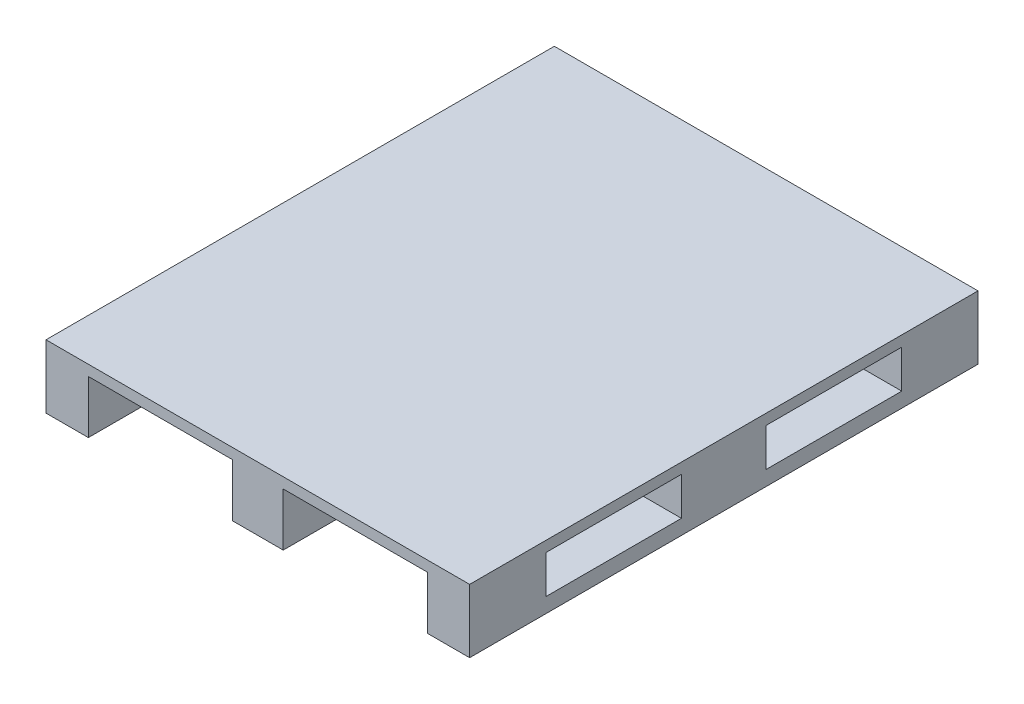
ISO-10303-21;
HEADER;
FILE_DESCRIPTION(('STEP AP214'),'2;1');
FILE_NAME('part.step','',(''),(''),'','','');
FILE_SCHEMA(('AUTOMOTIVE_DESIGN { 1 0 10303 214 1 1 1 1 }'));
ENDSEC;
DATA;
#1=APPLICATION_CONTEXT('core data for automotive mechanical design processes');
#2=APPLICATION_PROTOCOL_DEFINITION('international standard','automotive_design',2000,#1);
#3=PRODUCT_CONTEXT('',#1,'mechanical');
#4=PRODUCT('Part','Part','',(#3));
#5=PRODUCT_RELATED_PRODUCT_CATEGORY('part','',(#4));
#6=PRODUCT_DEFINITION_FORMATION('','',#4);
#7=PRODUCT_DEFINITION_CONTEXT('part definition',#1,'design');
#8=PRODUCT_DEFINITION('design','',#6,#7);
#9=PRODUCT_DEFINITION_SHAPE('','',#8);
#10=(LENGTH_UNIT() NAMED_UNIT(*) SI_UNIT(.MILLI.,.METRE.));
#11=(NAMED_UNIT(*) PLANE_ANGLE_UNIT() SI_UNIT($,.RADIAN.));
#12=(NAMED_UNIT(*) SI_UNIT($,.STERADIAN.) SOLID_ANGLE_UNIT());
#13=UNCERTAINTY_MEASURE_WITH_UNIT(LENGTH_MEASURE(1.E-05),#10,'distance_accuracy_value','');
#14=(GEOMETRIC_REPRESENTATION_CONTEXT(3) GLOBAL_UNCERTAINTY_ASSIGNED_CONTEXT((#13)) GLOBAL_UNIT_ASSIGNED_CONTEXT((#10,
#11,#12)) REPRESENTATION_CONTEXT('',''));
#15=CARTESIAN_POINT('',(0.,0.,0.));
#16=DIRECTION('',(0.,0.,1.));
#17=DIRECTION('',(1.,0.,0.));
#18=AXIS2_PLACEMENT_3D('',#15,#16,#17);
#19=CARTESIAN_POINT('',(0.,-75.,0.));
#20=DIRECTION('',(0.,1.,0.));
#21=DIRECTION('',(0.,0.,1.));
#22=AXIS2_PLACEMENT_3D('',#19,#20,#21);
#23=PLANE('',#22);
#24=DIRECTION('',(-1.,0.,0.));
#25=VECTOR('',#24,1.);
#26=CARTESIAN_POINT('',(500.,-75.,-600.));
#27=LINE('',#26,#25);
#28=CARTESIAN_POINT('',(-400.,-75.,-600.));
#29=VERTEX_POINT('',#28);
#30=CARTESIAN_POINT('',(-500.,-75.,-600.));
#31=VERTEX_POINT('',#30);
#32=EDGE_CURVE('E570',#29,#31,#27,.T.);
#33=ORIENTED_EDGE('',*,*,#32,.F.);
#34=DIRECTION('',(0.,0.,1.));
#35=VECTOR('',#34,1.);
#36=CARTESIAN_POINT('',(-400.,-75.,-600.001));
#37=LINE('',#36,#35);
#38=CARTESIAN_POINT('',(-400.,-75.,600.));
#39=VERTEX_POINT('',#38);
#40=EDGE_CURVE('E485',#29,#39,#37,.T.);
#41=ORIENTED_EDGE('',*,*,#40,.T.);
#42=DIRECTION('',(1.,0.,0.));
#43=VECTOR('',#42,1.);
#44=CARTESIAN_POINT('',(500.,-75.,600.));
#45=LINE('',#44,#43);
#46=CARTESIAN_POINT('',(-500.,-75.,600.));
#47=VERTEX_POINT('',#46);
#48=EDGE_CURVE('E563',#47,#39,#45,.T.);
#49=ORIENTED_EDGE('',*,*,#48,.F.);
#50=DIRECTION('',(0.,0.,1.));
#51=VECTOR('',#50,1.);
#52=CARTESIAN_POINT('',(-500.,-75.,600.));
#53=LINE('',#52,#51);
#54=EDGE_CURVE('E490',#31,#47,#53,.T.);
#55=ORIENTED_EDGE('',*,*,#54,.F.);
#56=EDGE_LOOP('',(#33,#41,#49,#55));
#57=FACE_BOUND('',#56,.T.);
#58=ADVANCED_FACE('F38',(#57),#23,.F.);
#59=CARTESIAN_POINT('',(-59.9999999999999,-75.,600.));
#60=VERTEX_POINT('',#59);
#61=CARTESIAN_POINT('',(60.0000000000001,-75.,600.));
#62=VERTEX_POINT('',#61);
#63=EDGE_CURVE('E568',#60,#62,#45,.T.);
#64=ORIENTED_EDGE('',*,*,#63,.F.);
#65=DIRECTION('',(0.,0.,1.));
#66=VECTOR('',#65,1.);
#67=CARTESIAN_POINT('',(-59.9999999999999,-75.,-600.001));
#68=LINE('',#67,#66);
#69=CARTESIAN_POINT('',(-59.9999999999999,-75.,-600.));
#70=VERTEX_POINT('',#69);
#71=EDGE_CURVE('E499',#70,#60,#68,.T.);
#72=ORIENTED_EDGE('',*,*,#71,.F.);
#73=CARTESIAN_POINT('',(60.0000000000001,-75.,-600.));
#74=VERTEX_POINT('',#73);
#75=EDGE_CURVE('E574',#74,#70,#27,.T.);
#76=ORIENTED_EDGE('',*,*,#75,.F.);
#77=DIRECTION('',(0.,0.,1.));
#78=VECTOR('',#77,1.);
#79=CARTESIAN_POINT('',(60.0000000000001,-75.,-600.001));
#80=LINE('',#79,#78);
#81=EDGE_CURVE('E526',#74,#62,#80,.T.);
#82=ORIENTED_EDGE('',*,*,#81,.T.);
#83=EDGE_LOOP('',(#64,#72,#76,#82));
#84=FACE_BOUND('',#83,.T.);
#85=ADVANCED_FACE('F664',(#84),#23,.F.);
#86=CARTESIAN_POINT('',(-500.,75.,600.));
#87=DIRECTION('',(1.,0.,0.));
#88=DIRECTION('',(0.,0.,-1.));
#89=AXIS2_PLACEMENT_3D('',#86,#87,#88);
#90=PLANE('',#89);
#91=DIRECTION('',(0.,0.,1.));
#92=VECTOR('',#91,1.);
#93=CARTESIAN_POINT('',(-500.,-40.,-100.));
#94=LINE('',#93,#92);
#95=CARTESIAN_POINT('',(-500.,-40.,-420.));
#96=VERTEX_POINT('',#95);
#97=CARTESIAN_POINT('',(-500.,-40.,-100.));
#98=VERTEX_POINT('',#97);
#99=EDGE_CURVE('E320',#96,#98,#94,.T.);
#100=ORIENTED_EDGE('',*,*,#99,.F.);
#101=DIRECTION('',(0.,-1.,0.));
#102=VECTOR('',#101,1.);
#103=CARTESIAN_POINT('',(-500.,-40.,-420.));
#104=LINE('',#103,#102);
#105=CARTESIAN_POINT('',(-500.,50.,-420.));
#106=VERTEX_POINT('',#105);
#107=EDGE_CURVE('E54',#106,#96,#104,.T.);
#108=ORIENTED_EDGE('',*,*,#107,.F.);
#109=DIRECTION('',(0.,0.,-1.));
#110=VECTOR('',#109,1.);
#111=CARTESIAN_POINT('',(-500.,50.,-100.));
#112=LINE('',#111,#110);
#113=CARTESIAN_POINT('',(-500.,50.,-100.));
#114=VERTEX_POINT('',#113);
#115=EDGE_CURVE('E305',#114,#106,#112,.T.);
#116=ORIENTED_EDGE('',*,*,#115,.F.);
#117=DIRECTION('',(0.,1.,0.));
#118=VECTOR('',#117,1.);
#119=CARTESIAN_POINT('',(-500.,-40.,-100.));
#120=LINE('',#119,#118);
#121=EDGE_CURVE('E311',#98,#114,#120,.T.);
#122=ORIENTED_EDGE('',*,*,#121,.F.);
#123=EDGE_LOOP('',(#100,#108,#116,#122));
#124=FACE_BOUND('',#123,.T.);
#125=DIRECTION('',(0.,0.,1.));
#126=VECTOR('',#125,1.);
#127=CARTESIAN_POINT('',(-500.,-40.,100.));
#128=LINE('',#127,#126);
#129=CARTESIAN_POINT('',(-500.,-40.,100.));
#130=VERTEX_POINT('',#129);
#131=CARTESIAN_POINT('',(-500.,-39.9999999999999,420.));
#132=VERTEX_POINT('',#131);
#133=EDGE_CURVE('E363',#130,#132,#128,.T.);
#134=ORIENTED_EDGE('',*,*,#133,.F.);
#135=DIRECTION('',(0.,-1.,0.));
#136=VECTOR('',#135,1.);
#137=CARTESIAN_POINT('',(-500.,-40.,100.));
#138=LINE('',#137,#136);
#139=CARTESIAN_POINT('',(-500.,50.,100.));
#140=VERTEX_POINT('',#139);
#141=EDGE_CURVE('E62',#140,#130,#138,.T.);
#142=ORIENTED_EDGE('',*,*,#141,.F.);
#143=DIRECTION('',(0.,0.,-1.));
#144=VECTOR('',#143,1.);
#145=CARTESIAN_POINT('',(-500.,50.,100.));
#146=LINE('',#145,#144);
#147=CARTESIAN_POINT('',(-500.,50.0000000000001,420.));
#148=VERTEX_POINT('',#147);
#149=EDGE_CURVE('E348',#148,#140,#146,.T.);
#150=ORIENTED_EDGE('',*,*,#149,.F.);
#151=DIRECTION('',(0.,1.,0.));
#152=VECTOR('',#151,1.);
#153=CARTESIAN_POINT('',(-500.,-39.9999999999999,420.));
#154=LINE('',#153,#152);
#155=EDGE_CURVE('E367',#132,#148,#154,.T.);
#156=ORIENTED_EDGE('',*,*,#155,.F.);
#157=EDGE_LOOP('',(#134,#142,#150,#156));
#158=FACE_BOUND('',#157,.T.);
#159=ORIENTED_EDGE('',*,*,#54,.T.);
#160=DIRECTION('',(0.,-1.,0.));
#161=VECTOR('',#160,1.);
#162=CARTESIAN_POINT('',(-500.,75.,600.));
#163=LINE('',#162,#161);
#164=CARTESIAN_POINT('',(-500.,75.,600.));
#165=VERTEX_POINT('',#164);
#166=EDGE_CURVE('E586',#165,#47,#163,.T.);
#167=ORIENTED_EDGE('',*,*,#166,.F.);
#168=DIRECTION('',(0.,0.,1.));
#169=VECTOR('',#168,1.);
#170=CARTESIAN_POINT('',(-500.,75.,600.));
#171=LINE('',#170,#169);
#172=CARTESIAN_POINT('',(-500.,75.,-600.));
#173=VERTEX_POINT('',#172);
#174=EDGE_CURVE('E544',#173,#165,#171,.T.);
#175=ORIENTED_EDGE('',*,*,#174,.F.);
#176=DIRECTION('',(0.,-1.,0.));
#177=VECTOR('',#176,1.);
#178=CARTESIAN_POINT('',(-500.,75.,-600.));
#179=LINE('',#178,#177);
#180=EDGE_CURVE('E558',#173,#31,#179,.T.);
#181=ORIENTED_EDGE('',*,*,#180,.T.);
#182=EDGE_LOOP('',(#159,#167,#175,#181));
#183=FACE_BOUND('',#182,.T.);
#184=ADVANCED_FACE('F40',(#124,#158,#183),#90,.F.);
#185=CARTESIAN_POINT('',(500.,75.,600.));
#186=DIRECTION('',(0.,0.,-1.));
#187=DIRECTION('',(-1.,0.,0.));
#188=AXIS2_PLACEMENT_3D('',#185,#186,#187);
#189=PLANE('',#188);
#190=ORIENTED_EDGE('',*,*,#48,.T.);
#191=DIRECTION('',(0.,-1.,0.));
#192=VECTOR('',#191,1.);
#193=CARTESIAN_POINT('',(-400.,50.,600.));
#194=LINE('',#193,#192);
#195=CARTESIAN_POINT('',(-400.,50.,600.));
#196=VERTEX_POINT('',#195);
#197=EDGE_CURVE('E474',#196,#39,#194,.T.);
#198=ORIENTED_EDGE('',*,*,#197,.F.);
#199=DIRECTION('',(-1.,0.,0.));
#200=VECTOR('',#199,1.);
#201=CARTESIAN_POINT('',(-59.9999999999999,50.,600.));
#202=LINE('',#201,#200);
#203=CARTESIAN_POINT('',(-59.9999999999999,50.,600.));
#204=VERTEX_POINT('',#203);
#205=EDGE_CURVE('E481',#204,#196,#202,.T.);
#206=ORIENTED_EDGE('',*,*,#205,.F.);
#207=DIRECTION('',(0.,1.,0.));
#208=VECTOR('',#207,1.);
#209=CARTESIAN_POINT('',(-59.9999999999999,50.,600.));
#210=LINE('',#209,#208);
#211=EDGE_CURVE('E477',#60,#204,#210,.T.);
#212=ORIENTED_EDGE('',*,*,#211,.F.);
#213=ORIENTED_EDGE('',*,*,#63,.T.);
#214=DIRECTION('',(0.,-1.,0.));
#215=VECTOR('',#214,1.);
#216=CARTESIAN_POINT('',(60.0000000000001,50.,600.));
#217=LINE('',#216,#215);
#218=CARTESIAN_POINT('',(60.0000000000001,50.,600.));
#219=VERTEX_POINT('',#218);
#220=EDGE_CURVE('E515',#219,#62,#217,.T.);
#221=ORIENTED_EDGE('',*,*,#220,.F.);
#222=DIRECTION('',(-1.,0.,0.));
#223=VECTOR('',#222,1.);
#224=CARTESIAN_POINT('',(60.0000000000001,50.,600.));
#225=LINE('',#224,#223);
#226=CARTESIAN_POINT('',(400.,50.,600.));
#227=VERTEX_POINT('',#226);
#228=EDGE_CURVE('E522',#227,#219,#225,.T.);
#229=ORIENTED_EDGE('',*,*,#228,.F.);
#230=DIRECTION('',(0.,1.,0.));
#231=VECTOR('',#230,1.);
#232=CARTESIAN_POINT('',(400.,50.,600.));
#233=LINE('',#232,#231);
#234=CARTESIAN_POINT('',(400.,-74.9999999999999,600.));
#235=VERTEX_POINT('',#234);
#236=EDGE_CURVE('E518',#235,#227,#233,.T.);
#237=ORIENTED_EDGE('',*,*,#236,.F.);
#238=CARTESIAN_POINT('',(500.,-75.,600.));
#239=VERTEX_POINT('',#238);
#240=EDGE_CURVE('E562',#235,#239,#45,.T.);
#241=ORIENTED_EDGE('',*,*,#240,.T.);
#242=DIRECTION('',(0.,-1.,0.));
#243=VECTOR('',#242,1.);
#244=CARTESIAN_POINT('',(500.,75.,600.));
#245=LINE('',#244,#243);
#246=CARTESIAN_POINT('',(500.,75.,600.));
#247=VERTEX_POINT('',#246);
#248=EDGE_CURVE('E582',#247,#239,#245,.T.);
#249=ORIENTED_EDGE('',*,*,#248,.F.);
#250=DIRECTION('',(1.,0.,0.));
#251=VECTOR('',#250,1.);
#252=CARTESIAN_POINT('',(500.,75.,600.));
#253=LINE('',#252,#251);
#254=EDGE_CURVE('E548',#165,#247,#253,.T.);
#255=ORIENTED_EDGE('',*,*,#254,.F.);
#256=ORIENTED_EDGE('',*,*,#166,.T.);
#257=EDGE_LOOP('',(#190,#198,#206,#212,#213,#221,#229,#237,#241,#249,#255,#256));
#258=FACE_BOUND('',#257,.T.);
#259=ADVANCED_FACE('F672',(#258),#189,.F.);
#260=CARTESIAN_POINT('',(500.,75.,600.));
#261=DIRECTION('',(-1.,0.,0.));
#262=DIRECTION('',(0.,0.,1.));
#263=AXIS2_PLACEMENT_3D('',#260,#261,#262);
#264=PLANE('',#263);
#265=DIRECTION('',(0.,0.,-1.));
#266=VECTOR('',#265,1.);
#267=CARTESIAN_POINT('',(500.,50.,-100.));
#268=LINE('',#267,#266);
#269=CARTESIAN_POINT('',(500.,50.,-100.));
#270=VERTEX_POINT('',#269);
#271=CARTESIAN_POINT('',(500.,50.,-420.));
#272=VERTEX_POINT('',#271);
#273=EDGE_CURVE('E303',#270,#272,#268,.T.);
#274=ORIENTED_EDGE('',*,*,#273,.T.);
#275=DIRECTION('',(0.,-1.,0.));
#276=VECTOR('',#275,1.);
#277=CARTESIAN_POINT('',(500.,-40.,-420.));
#278=LINE('',#277,#276);
#279=CARTESIAN_POINT('',(500.,-40.,-420.));
#280=VERTEX_POINT('',#279);
#281=EDGE_CURVE('E278',#272,#280,#278,.T.);
#282=ORIENTED_EDGE('',*,*,#281,.T.);
#283=DIRECTION('',(0.,0.,1.));
#284=VECTOR('',#283,1.);
#285=CARTESIAN_POINT('',(500.,-40.,-100.));
#286=LINE('',#285,#284);
#287=CARTESIAN_POINT('',(500.,-40.,-100.));
#288=VERTEX_POINT('',#287);
#289=EDGE_CURVE('E291',#280,#288,#286,.T.);
#290=ORIENTED_EDGE('',*,*,#289,.T.);
#291=DIRECTION('',(0.,1.,0.));
#292=VECTOR('',#291,1.);
#293=CARTESIAN_POINT('',(500.,-40.,-100.));
#294=LINE('',#293,#292);
#295=EDGE_CURVE('E298',#288,#270,#294,.T.);
#296=ORIENTED_EDGE('',*,*,#295,.T.);
#297=EDGE_LOOP('',(#274,#282,#290,#296));
#298=FACE_BOUND('',#297,.T.);
#299=DIRECTION('',(0.,0.,-1.));
#300=VECTOR('',#299,1.);
#301=CARTESIAN_POINT('',(500.,50.,100.));
#302=LINE('',#301,#300);
#303=CARTESIAN_POINT('',(500.,50.0000000000001,420.));
#304=VERTEX_POINT('',#303);
#305=CARTESIAN_POINT('',(500.,50.,100.));
#306=VERTEX_POINT('',#305);
#307=EDGE_CURVE('E356',#304,#306,#302,.T.);
#308=ORIENTED_EDGE('',*,*,#307,.T.);
#309=DIRECTION('',(0.,-1.,0.));
#310=VECTOR('',#309,1.);
#311=CARTESIAN_POINT('',(500.,-40.,100.));
#312=LINE('',#311,#310);
#313=CARTESIAN_POINT('',(500.,-40.,100.));
#314=VERTEX_POINT('',#313);
#315=EDGE_CURVE('E343',#306,#314,#312,.T.);
#316=ORIENTED_EDGE('',*,*,#315,.T.);
#317=DIRECTION('',(0.,0.,1.));
#318=VECTOR('',#317,1.);
#319=CARTESIAN_POINT('',(500.,-40.,100.));
#320=LINE('',#319,#318);
#321=CARTESIAN_POINT('',(500.,-39.9999999999999,420.));
#322=VERTEX_POINT('',#321);
#323=EDGE_CURVE('E347',#314,#322,#320,.T.);
#324=ORIENTED_EDGE('',*,*,#323,.T.);
#325=DIRECTION('',(0.,1.,0.));
#326=VECTOR('',#325,1.);
#327=CARTESIAN_POINT('',(500.,-39.9999999999999,420.));
#328=LINE('',#327,#326);
#329=EDGE_CURVE('E352',#322,#304,#328,.T.);
#330=ORIENTED_EDGE('',*,*,#329,.T.);
#331=EDGE_LOOP('',(#308,#316,#324,#330));
#332=FACE_BOUND('',#331,.T.);
#333=DIRECTION('',(0.,0.,-1.));
#334=VECTOR('',#333,1.);
#335=CARTESIAN_POINT('',(500.,-75.,600.));
#336=LINE('',#335,#334);
#337=CARTESIAN_POINT('',(500.,-75.,-600.));
#338=VERTEX_POINT('',#337);
#339=EDGE_CURVE('E567',#239,#338,#336,.T.);
#340=ORIENTED_EDGE('',*,*,#339,.T.);
#341=DIRECTION('',(0.,-1.,0.));
#342=VECTOR('',#341,1.);
#343=CARTESIAN_POINT('',(500.,75.,-600.));
#344=LINE('',#343,#342);
#345=CARTESIAN_POINT('',(500.,75.,-600.));
#346=VERTEX_POINT('',#345);
#347=EDGE_CURVE('E578',#346,#338,#344,.T.);
#348=ORIENTED_EDGE('',*,*,#347,.F.);
#349=DIRECTION('',(0.,0.,-1.));
#350=VECTOR('',#349,1.);
#351=CARTESIAN_POINT('',(500.,75.,600.));
#352=LINE('',#351,#350);
#353=EDGE_CURVE('E552',#247,#346,#352,.T.);
#354=ORIENTED_EDGE('',*,*,#353,.F.);
#355=ORIENTED_EDGE('',*,*,#248,.T.);
#356=EDGE_LOOP('',(#340,#348,#354,#355));
#357=FACE_BOUND('',#356,.T.);
#358=ADVANCED_FACE('F300',(#298,#332,#357),#264,.F.);
#359=CARTESIAN_POINT('',(500.,75.,-600.));
#360=DIRECTION('',(0.,0.,1.));
#361=DIRECTION('',(1.,0.,0.));
#362=AXIS2_PLACEMENT_3D('',#359,#360,#361);
#363=PLANE('',#362);
#364=DIRECTION('',(1.,0.,0.));
#365=VECTOR('',#364,1.);
#366=CARTESIAN_POINT('',(-59.9999999999999,50.,-600.));
#367=LINE('',#366,#365);
#368=CARTESIAN_POINT('',(-400.,50.,-600.));
#369=VERTEX_POINT('',#368);
#370=CARTESIAN_POINT('',(-59.9999999999999,50.,-600.));
#371=VERTEX_POINT('',#370);
#372=EDGE_CURVE('E465',#369,#371,#367,.T.);
#373=ORIENTED_EDGE('',*,*,#372,.F.);
#374=DIRECTION('',(0.,1.,0.));
#375=VECTOR('',#374,1.);
#376=CARTESIAN_POINT('',(-400.,50.,-600.));
#377=LINE('',#376,#375);
#378=EDGE_CURVE('E470',#29,#369,#377,.T.);
#379=ORIENTED_EDGE('',*,*,#378,.F.);
#380=ORIENTED_EDGE('',*,*,#32,.T.);
#381=ORIENTED_EDGE('',*,*,#180,.F.);
#382=DIRECTION('',(-1.,0.,0.));
#383=VECTOR('',#382,1.);
#384=CARTESIAN_POINT('',(500.,75.,-600.));
#385=LINE('',#384,#383);
#386=EDGE_CURVE('E555',#346,#173,#385,.T.);
#387=ORIENTED_EDGE('',*,*,#386,.F.);
#388=ORIENTED_EDGE('',*,*,#347,.T.);
#389=CARTESIAN_POINT('',(400.,-75.,-600.));
#390=VERTEX_POINT('',#389);
#391=EDGE_CURVE('E549',#338,#390,#27,.T.);
#392=ORIENTED_EDGE('',*,*,#391,.T.);
#393=DIRECTION('',(0.,-1.,0.));
#394=VECTOR('',#393,1.);
#395=CARTESIAN_POINT('',(400.,50.,-600.));
#396=LINE('',#395,#394);
#397=CARTESIAN_POINT('',(400.,50.,-600.));
#398=VERTEX_POINT('',#397);
#399=EDGE_CURVE('E461',#398,#390,#396,.T.);
#400=ORIENTED_EDGE('',*,*,#399,.F.);
#401=DIRECTION('',(1.,0.,0.));
#402=VECTOR('',#401,1.);
#403=CARTESIAN_POINT('',(60.0000000000001,50.,-600.));
#404=LINE('',#403,#402);
#405=CARTESIAN_POINT('',(60.0000000000001,50.,-600.));
#406=VERTEX_POINT('',#405);
#407=EDGE_CURVE('E507',#406,#398,#404,.T.);
#408=ORIENTED_EDGE('',*,*,#407,.F.);
#409=DIRECTION('',(0.,1.,0.));
#410=VECTOR('',#409,1.);
#411=CARTESIAN_POINT('',(60.0000000000001,50.,-600.));
#412=LINE('',#411,#410);
#413=EDGE_CURVE('E511',#74,#406,#412,.T.);
#414=ORIENTED_EDGE('',*,*,#413,.F.);
#415=ORIENTED_EDGE('',*,*,#75,.T.);
#416=DIRECTION('',(0.,-1.,0.));
#417=VECTOR('',#416,1.);
#418=CARTESIAN_POINT('',(-59.9999999999999,50.,-600.));
#419=LINE('',#418,#417);
#420=EDGE_CURVE('E462',#371,#70,#419,.T.);
#421=ORIENTED_EDGE('',*,*,#420,.F.);
#422=EDGE_LOOP('',(#373,#379,#380,#381,#387,#388,#392,#400,#408,#414,#415,#421));
#423=FACE_BOUND('',#422,.T.);
#424=ADVANCED_FACE('F657',(#423),#363,.F.);
#425=CARTESIAN_POINT('',(0.,75.,0.));
#426=DIRECTION('',(0.,1.,0.));
#427=DIRECTION('',(0.,0.,1.));
#428=AXIS2_PLACEMENT_3D('',#425,#426,#427);
#429=PLANE('',#428);
#430=ORIENTED_EDGE('',*,*,#174,.T.);
#431=ORIENTED_EDGE('',*,*,#254,.T.);
#432=ORIENTED_EDGE('',*,*,#353,.T.);
#433=ORIENTED_EDGE('',*,*,#386,.T.);
#434=EDGE_LOOP('',(#430,#431,#432,#433));
#435=FACE_BOUND('',#434,.T.);
#436=ADVANCED_FACE('F688',(#435),#429,.T.);
#437=ORIENTED_EDGE('',*,*,#240,.F.);
#438=DIRECTION('',(0.,0.,1.));
#439=VECTOR('',#438,1.);
#440=CARTESIAN_POINT('',(400.,-74.9999999999999,-600.001));
#441=LINE('',#440,#439);
#442=EDGE_CURVE('E538',#390,#235,#441,.T.);
#443=ORIENTED_EDGE('',*,*,#442,.F.);
#444=ORIENTED_EDGE('',*,*,#391,.F.);
#445=ORIENTED_EDGE('',*,*,#339,.F.);
#446=EDGE_LOOP('',(#437,#443,#444,#445));
#447=FACE_BOUND('',#446,.T.);
#448=ADVANCED_FACE('F681',(#447),#23,.F.);
#449=CARTESIAN_POINT('',(60.0000000000001,50.,-600.001));
#450=DIRECTION('',(-1.,0.,0.));
#451=DIRECTION('',(0.,-1.,0.));
#452=AXIS2_PLACEMENT_3D('',#449,#450,#451);
#453=PLANE('',#452);
#454=DIRECTION('',(0.,0.,1.));
#455=VECTOR('',#454,1.);
#456=CARTESIAN_POINT('',(60.0000000000001,50.,-600.001));
#457=LINE('',#456,#455);
#458=CARTESIAN_POINT('',(60.0000000000001,50.,-420.));
#459=VERTEX_POINT('',#458);
#460=EDGE_CURVE('E466',#406,#459,#457,.T.);
#461=ORIENTED_EDGE('',*,*,#460,.T.);
#462=DIRECTION('',(0.,-1.,0.));
#463=VECTOR('',#462,1.);
#464=CARTESIAN_POINT('',(60.0000000000001,50.,-420.));
#465=LINE('',#464,#463);
#466=CARTESIAN_POINT('',(60.0000000000001,-40.,-420.));
#467=VERTEX_POINT('',#466);
#468=EDGE_CURVE('E457',#459,#467,#465,.T.);
#469=ORIENTED_EDGE('',*,*,#468,.T.);
#470=DIRECTION('',(0.,0.,1.));
#471=VECTOR('',#470,1.);
#472=CARTESIAN_POINT('',(60.0000000000001,-40.0000000000001,-600.001));
#473=LINE('',#472,#471);
#474=CARTESIAN_POINT('',(60.0000000000001,-40.,-100.));
#475=VERTEX_POINT('',#474);
#476=EDGE_CURVE('E435',#467,#475,#473,.T.);
#477=ORIENTED_EDGE('',*,*,#476,.T.);
#478=DIRECTION('',(0.,1.,0.));
#479=VECTOR('',#478,1.);
#480=CARTESIAN_POINT('',(60.0000000000001,50.,-100.));
#481=LINE('',#480,#479);
#482=CARTESIAN_POINT('',(60.0000000000001,50.,-100.));
#483=VERTEX_POINT('',#482);
#484=EDGE_CURVE('E447',#475,#483,#481,.T.);
#485=ORIENTED_EDGE('',*,*,#484,.T.);
#486=CARTESIAN_POINT('',(60.0000000000001,50.,100.));
#487=VERTEX_POINT('',#486);
#488=EDGE_CURVE('E530',#483,#487,#457,.T.);
#489=ORIENTED_EDGE('',*,*,#488,.T.);
#490=DIRECTION('',(0.,-1.,0.));
#491=VECTOR('',#490,1.);
#492=CARTESIAN_POINT('',(60.0000000000001,50.,100.));
#493=LINE('',#492,#491);
#494=CARTESIAN_POINT('',(60.0000000000001,-40.,100.));
#495=VERTEX_POINT('',#494);
#496=EDGE_CURVE('E424',#487,#495,#493,.T.);
#497=ORIENTED_EDGE('',*,*,#496,.T.);
#498=DIRECTION('',(0.,0.,1.));
#499=VECTOR('',#498,1.);
#500=CARTESIAN_POINT('',(60.0000000000001,-40.,-600.001));
#501=LINE('',#500,#499);
#502=CARTESIAN_POINT('',(60.0000000000001,-39.9999999999999,420.));
#503=VERTEX_POINT('',#502);
#504=EDGE_CURVE('E400',#495,#503,#501,.T.);
#505=ORIENTED_EDGE('',*,*,#504,.T.);
#506=DIRECTION('',(0.,1.,0.));
#507=VECTOR('',#506,1.);
#508=CARTESIAN_POINT('',(60.0000000000001,50.,420.));
#509=LINE('',#508,#507);
#510=CARTESIAN_POINT('',(60.0000000000001,50.0000000000001,420.));
#511=VERTEX_POINT('',#510);
#512=EDGE_CURVE('E412',#503,#511,#509,.T.);
#513=ORIENTED_EDGE('',*,*,#512,.T.);
#514=EDGE_CURVE('E531',#511,#219,#457,.T.);
#515=ORIENTED_EDGE('',*,*,#514,.T.);
#516=ORIENTED_EDGE('',*,*,#220,.T.);
#517=ORIENTED_EDGE('',*,*,#81,.F.);
#518=ORIENTED_EDGE('',*,*,#413,.T.);
#519=EDGE_LOOP('',(#461,#469,#477,#485,#489,#497,#505,#513,#515,#516,#517,#518));
#520=FACE_BOUND('',#519,.T.);
#521=ADVANCED_FACE('F737',(#520),#453,.F.);
#522=CARTESIAN_POINT('',(400.,50.,-600.001));
#523=DIRECTION('',(1.,0.,0.));
#524=DIRECTION('',(0.,0.,-1.));
#525=AXIS2_PLACEMENT_3D('',#522,#523,#524);
#526=PLANE('',#525);
#527=DIRECTION('',(0.,0.,-1.));
#528=VECTOR('',#527,1.);
#529=CARTESIAN_POINT('',(400.,-40.0000000000001,-600.001));
#530=LINE('',#529,#528);
#531=CARTESIAN_POINT('',(400.,-40.,-100.));
#532=VERTEX_POINT('',#531);
#533=CARTESIAN_POINT('',(400.,-40.,-420.));
#534=VERTEX_POINT('',#533);
#535=EDGE_CURVE('E432',#532,#534,#530,.T.);
#536=ORIENTED_EDGE('',*,*,#535,.T.);
#537=DIRECTION('',(0.,1.,0.));
#538=VECTOR('',#537,1.);
#539=CARTESIAN_POINT('',(400.,50.,-420.));
#540=LINE('',#539,#538);
#541=CARTESIAN_POINT('',(400.,50.,-420.));
#542=VERTEX_POINT('',#541);
#543=EDGE_CURVE('E281',#534,#542,#540,.T.);
#544=ORIENTED_EDGE('',*,*,#543,.T.);
#545=DIRECTION('',(0.,0.,1.));
#546=VECTOR('',#545,1.);
#547=CARTESIAN_POINT('',(400.,50.,-600.001));
#548=LINE('',#547,#546);
#549=EDGE_CURVE('E532',#398,#542,#548,.T.);
#550=ORIENTED_EDGE('',*,*,#549,.F.);
#551=ORIENTED_EDGE('',*,*,#399,.T.);
#552=ORIENTED_EDGE('',*,*,#442,.T.);
#553=ORIENTED_EDGE('',*,*,#236,.T.);
#554=CARTESIAN_POINT('',(400.,50.0000000000001,420.));
#555=VERTEX_POINT('',#554);
#556=EDGE_CURVE('E537',#555,#227,#548,.T.);
#557=ORIENTED_EDGE('',*,*,#556,.F.);
#558=DIRECTION('',(0.,-1.,0.));
#559=VECTOR('',#558,1.);
#560=CARTESIAN_POINT('',(400.,50.,420.));
#561=LINE('',#560,#559);
#562=CARTESIAN_POINT('',(400.,-39.9999999999999,420.));
#563=VERTEX_POINT('',#562);
#564=EDGE_CURVE('E408',#555,#563,#561,.T.);
#565=ORIENTED_EDGE('',*,*,#564,.T.);
#566=DIRECTION('',(0.,0.,-1.));
#567=VECTOR('',#566,1.);
#568=CARTESIAN_POINT('',(400.,-40.,-600.001));
#569=LINE('',#568,#567);
#570=CARTESIAN_POINT('',(400.,-40.,100.));
#571=VERTEX_POINT('',#570);
#572=EDGE_CURVE('E396',#563,#571,#569,.T.);
#573=ORIENTED_EDGE('',*,*,#572,.T.);
#574=DIRECTION('',(0.,1.,0.));
#575=VECTOR('',#574,1.);
#576=CARTESIAN_POINT('',(400.,50.,100.));
#577=LINE('',#576,#575);
#578=CARTESIAN_POINT('',(400.,50.,100.));
#579=VERTEX_POINT('',#578);
#580=EDGE_CURVE('E420',#571,#579,#577,.T.);
#581=ORIENTED_EDGE('',*,*,#580,.T.);
#582=CARTESIAN_POINT('',(400.,50.,-100.));
#583=VERTEX_POINT('',#582);
#584=EDGE_CURVE('E536',#583,#579,#548,.T.);
#585=ORIENTED_EDGE('',*,*,#584,.F.);
#586=DIRECTION('',(0.,-1.,0.));
#587=VECTOR('',#586,1.);
#588=CARTESIAN_POINT('',(400.,50.,-100.));
#589=LINE('',#588,#587);
#590=EDGE_CURVE('E443',#583,#532,#589,.T.);
#591=ORIENTED_EDGE('',*,*,#590,.T.);
#592=EDGE_LOOP('',(#536,#544,#550,#551,#552,#553,#557,#565,#573,#581,#585,#591));
#593=FACE_BOUND('',#592,.T.);
#594=ADVANCED_FACE('F735',(#593),#526,.F.);
#595=CARTESIAN_POINT('',(-400.,50.,-600.001));
#596=DIRECTION('',(-1.,0.,0.));
#597=DIRECTION('',(0.,0.,1.));
#598=AXIS2_PLACEMENT_3D('',#595,#596,#597);
#599=PLANE('',#598);
#600=DIRECTION('',(0.,0.,1.));
#601=VECTOR('',#600,1.);
#602=CARTESIAN_POINT('',(-400.,50.,-600.001));
#603=LINE('',#602,#601);
#604=CARTESIAN_POINT('',(-400.,50.,-420.));
#605=VERTEX_POINT('',#604);
#606=EDGE_CURVE('E486',#369,#605,#603,.T.);
#607=ORIENTED_EDGE('',*,*,#606,.T.);
#608=DIRECTION('',(0.,-1.,0.));
#609=VECTOR('',#608,1.);
#610=CARTESIAN_POINT('',(-400.,50.,-420.));
#611=LINE('',#610,#609);
#612=CARTESIAN_POINT('',(-400.,-40.,-420.));
#613=VERTEX_POINT('',#612);
#614=EDGE_CURVE('E451',#605,#613,#611,.T.);
#615=ORIENTED_EDGE('',*,*,#614,.T.);
#616=DIRECTION('',(0.,0.,1.));
#617=VECTOR('',#616,1.);
#618=CARTESIAN_POINT('',(-400.,-40.0000000000001,-600.001));
#619=LINE('',#618,#617);
#620=CARTESIAN_POINT('',(-400.,-40.,-100.));
#621=VERTEX_POINT('',#620);
#622=EDGE_CURVE('E428',#613,#621,#619,.T.);
#623=ORIENTED_EDGE('',*,*,#622,.T.);
#624=DIRECTION('',(0.,1.,0.));
#625=VECTOR('',#624,1.);
#626=CARTESIAN_POINT('',(-400.,50.,-100.));
#627=LINE('',#626,#625);
#628=CARTESIAN_POINT('',(-400.,50.,-100.));
#629=VERTEX_POINT('',#628);
#630=EDGE_CURVE('E439',#621,#629,#627,.T.);
#631=ORIENTED_EDGE('',*,*,#630,.T.);
#632=CARTESIAN_POINT('',(-400.,50.,100.));
#633=VERTEX_POINT('',#632);
#634=EDGE_CURVE('E491',#629,#633,#603,.T.);
#635=ORIENTED_EDGE('',*,*,#634,.T.);
#636=DIRECTION('',(0.,-1.,0.));
#637=VECTOR('',#636,1.);
#638=CARTESIAN_POINT('',(-400.,50.,100.));
#639=LINE('',#638,#637);
#640=CARTESIAN_POINT('',(-400.,-40.,100.));
#641=VERTEX_POINT('',#640);
#642=EDGE_CURVE('E416',#633,#641,#639,.T.);
#643=ORIENTED_EDGE('',*,*,#642,.T.);
#644=DIRECTION('',(0.,0.,1.));
#645=VECTOR('',#644,1.);
#646=CARTESIAN_POINT('',(-400.,-40.,-600.001));
#647=LINE('',#646,#645);
#648=CARTESIAN_POINT('',(-400.,-39.9999999999999,420.));
#649=VERTEX_POINT('',#648);
#650=EDGE_CURVE('E331',#641,#649,#647,.T.);
#651=ORIENTED_EDGE('',*,*,#650,.T.);
#652=DIRECTION('',(0.,1.,0.));
#653=VECTOR('',#652,1.);
#654=CARTESIAN_POINT('',(-400.,50.,420.));
#655=LINE('',#654,#653);
#656=CARTESIAN_POINT('',(-400.,50.0000000000001,420.));
#657=VERTEX_POINT('',#656);
#658=EDGE_CURVE('E404',#649,#657,#655,.T.);
#659=ORIENTED_EDGE('',*,*,#658,.T.);
#660=EDGE_CURVE('E492',#657,#196,#603,.T.);
#661=ORIENTED_EDGE('',*,*,#660,.T.);
#662=ORIENTED_EDGE('',*,*,#197,.T.);
#663=ORIENTED_EDGE('',*,*,#40,.F.);
#664=ORIENTED_EDGE('',*,*,#378,.T.);
#665=EDGE_LOOP('',(#607,#615,#623,#631,#635,#643,#651,#659,#661,#662,#663,#664));
#666=FACE_BOUND('',#665,.T.);
#667=ADVANCED_FACE('F696',(#666),#599,.F.);
#668=CARTESIAN_POINT('',(-59.9999999999999,50.,-600.001));
#669=DIRECTION('',(0.,1.,0.));
#670=DIRECTION('',(-1.,0.,0.));
#671=AXIS2_PLACEMENT_3D('',#668,#669,#670);
#672=PLANE('',#671);
#673=DIRECTION('',(-1.,0.,0.));
#674=VECTOR('',#673,1.);
#675=CARTESIAN_POINT('',(500.,50.,-420.));
#676=LINE('',#675,#674);
#677=CARTESIAN_POINT('',(-59.9999999999998,50.,-420.));
#678=VERTEX_POINT('',#677);
#679=EDGE_CURVE('E332',#459,#678,#676,.T.);
#680=ORIENTED_EDGE('',*,*,#679,.F.);
#681=ORIENTED_EDGE('',*,*,#460,.F.);
#682=ORIENTED_EDGE('',*,*,#407,.T.);
#683=ORIENTED_EDGE('',*,*,#549,.T.);
#684=EDGE_CURVE('E328',#272,#542,#676,.T.);
#685=ORIENTED_EDGE('',*,*,#684,.F.);
#686=ORIENTED_EDGE('',*,*,#273,.F.);
#687=DIRECTION('',(-1.,0.,0.));
#688=VECTOR('',#687,1.);
#689=CARTESIAN_POINT('',(500.,50.,-100.));
#690=LINE('',#689,#688);
#691=EDGE_CURVE('E334',#270,#583,#690,.T.);
#692=ORIENTED_EDGE('',*,*,#691,.T.);
#693=ORIENTED_EDGE('',*,*,#584,.T.);
#694=DIRECTION('',(-1.,0.,0.));
#695=VECTOR('',#694,1.);
#696=CARTESIAN_POINT('',(500.,50.,100.));
#697=LINE('',#696,#695);
#698=EDGE_CURVE('E321',#306,#579,#697,.T.);
#699=ORIENTED_EDGE('',*,*,#698,.F.);
#700=ORIENTED_EDGE('',*,*,#307,.F.);
#701=DIRECTION('',(-1.,0.,0.));
#702=VECTOR('',#701,1.);
#703=CARTESIAN_POINT('',(500.,50.0000000000001,420.));
#704=LINE('',#703,#702);
#705=EDGE_CURVE('E377',#304,#555,#704,.T.);
#706=ORIENTED_EDGE('',*,*,#705,.T.);
#707=ORIENTED_EDGE('',*,*,#556,.T.);
#708=ORIENTED_EDGE('',*,*,#228,.T.);
#709=ORIENTED_EDGE('',*,*,#514,.F.);
#710=CARTESIAN_POINT('',(-59.9999999999998,50.0000000000001,420.));
#711=VERTEX_POINT('',#710);
#712=EDGE_CURVE('E381',#511,#711,#704,.T.);
#713=ORIENTED_EDGE('',*,*,#712,.T.);
#714=DIRECTION('',(0.,0.,1.));
#715=VECTOR('',#714,1.);
#716=CARTESIAN_POINT('',(-59.9999999999999,50.,-600.001));
#717=LINE('',#716,#715);
#718=EDGE_CURVE('E498',#711,#204,#717,.T.);
#719=ORIENTED_EDGE('',*,*,#718,.T.);
#720=ORIENTED_EDGE('',*,*,#205,.T.);
#721=ORIENTED_EDGE('',*,*,#660,.F.);
#722=EDGE_CURVE('E382',#657,#148,#704,.T.);
#723=ORIENTED_EDGE('',*,*,#722,.T.);
#724=ORIENTED_EDGE('',*,*,#149,.T.);
#725=EDGE_CURVE('E376',#633,#140,#697,.T.);
#726=ORIENTED_EDGE('',*,*,#725,.F.);
#727=ORIENTED_EDGE('',*,*,#634,.F.);
#728=EDGE_CURVE('E339',#629,#114,#690,.T.);
#729=ORIENTED_EDGE('',*,*,#728,.T.);
#730=ORIENTED_EDGE('',*,*,#115,.T.);
#731=EDGE_CURVE('E333',#605,#106,#676,.T.);
#732=ORIENTED_EDGE('',*,*,#731,.F.);
#733=ORIENTED_EDGE('',*,*,#606,.F.);
#734=ORIENTED_EDGE('',*,*,#372,.T.);
#735=EDGE_CURVE('E493',#371,#678,#717,.T.);
#736=ORIENTED_EDGE('',*,*,#735,.T.);
#737=EDGE_LOOP('',(#680,#681,#682,#683,#685,#686,#692,#693,#699,#700,#706,#707,#708,#709,#713,
#719,#720,#721,#723,#724,#726,#727,#729,#730,#732,#733,#734,#736));
#738=FACE_BOUND('',#737,.T.);
#739=ORIENTED_EDGE('',*,*,#488,.F.);
#740=CARTESIAN_POINT('',(-59.9999999999998,50.,-100.));
#741=VERTEX_POINT('',#740);
#742=EDGE_CURVE('E338',#483,#741,#690,.T.);
#743=ORIENTED_EDGE('',*,*,#742,.T.);
#744=CARTESIAN_POINT('',(-59.9999999999998,50.,100.));
#745=VERTEX_POINT('',#744);
#746=EDGE_CURVE('E497',#741,#745,#717,.T.);
#747=ORIENTED_EDGE('',*,*,#746,.T.);
#748=EDGE_CURVE('E375',#487,#745,#697,.T.);
#749=ORIENTED_EDGE('',*,*,#748,.F.);
#750=EDGE_LOOP('',(#739,#743,#747,#749));
#751=FACE_BOUND('',#750,.T.);
#752=ADVANCED_FACE('F618',(#738,#751),#672,.F.);
#753=CARTESIAN_POINT('',(-59.9999999999999,50.,-600.001));
#754=DIRECTION('',(1.,0.,0.));
#755=DIRECTION('',(0.,1.,0.));
#756=AXIS2_PLACEMENT_3D('',#753,#754,#755);
#757=PLANE('',#756);
#758=DIRECTION('',(0.,0.,-1.));
#759=VECTOR('',#758,1.);
#760=CARTESIAN_POINT('',(-59.9999999999999,-40.0000000000001,-600.001));
#761=LINE('',#760,#759);
#762=CARTESIAN_POINT('',(-59.9999999999998,-40.,-100.));
#763=VERTEX_POINT('',#762);
#764=CARTESIAN_POINT('',(-59.9999999999999,-40.,-420.));
#765=VERTEX_POINT('',#764);
#766=EDGE_CURVE('E602',#763,#765,#761,.T.);
#767=ORIENTED_EDGE('',*,*,#766,.T.);
#768=DIRECTION('',(0.,1.,0.));
#769=VECTOR('',#768,1.);
#770=CARTESIAN_POINT('',(-59.9999999999999,50.,-420.));
#771=LINE('',#770,#769);
#772=EDGE_CURVE('E11',#765,#678,#771,.T.);
#773=ORIENTED_EDGE('',*,*,#772,.T.);
#774=ORIENTED_EDGE('',*,*,#735,.F.);
#775=ORIENTED_EDGE('',*,*,#420,.T.);
#776=ORIENTED_EDGE('',*,*,#71,.T.);
#777=ORIENTED_EDGE('',*,*,#211,.T.);
#778=ORIENTED_EDGE('',*,*,#718,.F.);
#779=DIRECTION('',(0.,-1.,0.));
#780=VECTOR('',#779,1.);
#781=CARTESIAN_POINT('',(-59.9999999999999,50.,420.));
#782=LINE('',#781,#780);
#783=CARTESIAN_POINT('',(-59.9999999999998,-39.9999999999999,420.));
#784=VERTEX_POINT('',#783);
#785=EDGE_CURVE('E594',#711,#784,#782,.T.);
#786=ORIENTED_EDGE('',*,*,#785,.T.);
#787=DIRECTION('',(0.,0.,-1.));
#788=VECTOR('',#787,1.);
#789=CARTESIAN_POINT('',(-59.9999999999999,-40.,-600.001));
#790=LINE('',#789,#788);
#791=CARTESIAN_POINT('',(-59.9999999999999,-40.,100.));
#792=VERTEX_POINT('',#791);
#793=EDGE_CURVE('E590',#784,#792,#790,.T.);
#794=ORIENTED_EDGE('',*,*,#793,.T.);
#795=DIRECTION('',(0.,1.,0.));
#796=VECTOR('',#795,1.);
#797=CARTESIAN_POINT('',(-59.9999999999999,50.,100.));
#798=LINE('',#797,#796);
#799=EDGE_CURVE('E598',#792,#745,#798,.T.);
#800=ORIENTED_EDGE('',*,*,#799,.T.);
#801=ORIENTED_EDGE('',*,*,#746,.F.);
#802=DIRECTION('',(0.,-1.,0.));
#803=VECTOR('',#802,1.);
#804=CARTESIAN_POINT('',(-59.9999999999999,50.,-100.));
#805=LINE('',#804,#803);
#806=EDGE_CURVE('E47',#741,#763,#805,.T.);
#807=ORIENTED_EDGE('',*,*,#806,.T.);
#808=EDGE_LOOP('',(#767,#773,#774,#775,#776,#777,#778,#786,#794,#800,#801,#807));
#809=FACE_BOUND('',#808,.T.);
#810=ADVANCED_FACE('F609',(#809),#757,.F.);
#811=CARTESIAN_POINT('',(500.,-40.,100.));
#812=DIRECTION('',(0.,-1.,0.));
#813=DIRECTION('',(0.,0.,-1.));
#814=AXIS2_PLACEMENT_3D('',#811,#812,#813);
#815=PLANE('',#814);
#816=DIRECTION('',(-1.,0.,0.));
#817=VECTOR('',#816,1.);
#818=CARTESIAN_POINT('',(500.,-40.,100.));
#819=LINE('',#818,#817);
#820=EDGE_CURVE('E392',#495,#792,#819,.T.);
#821=ORIENTED_EDGE('',*,*,#820,.T.);
#822=ORIENTED_EDGE('',*,*,#793,.F.);
#823=DIRECTION('',(-1.,0.,0.));
#824=VECTOR('',#823,1.);
#825=CARTESIAN_POINT('',(500.,-39.9999999999999,420.));
#826=LINE('',#825,#824);
#827=EDGE_CURVE('E387',#503,#784,#826,.T.);
#828=ORIENTED_EDGE('',*,*,#827,.F.);
#829=ORIENTED_EDGE('',*,*,#504,.F.);
#830=EDGE_LOOP('',(#821,#822,#828,#829));
#831=FACE_BOUND('',#830,.T.);
#832=ADVANCED_FACE('F738',(#831),#815,.F.);
#833=CARTESIAN_POINT('',(500.,-39.9999999999999,420.));
#834=DIRECTION('',(0.,0.,1.));
#835=DIRECTION('',(1.,0.,0.));
#836=AXIS2_PLACEMENT_3D('',#833,#834,#835);
#837=PLANE('',#836);
#838=ORIENTED_EDGE('',*,*,#827,.T.);
#839=ORIENTED_EDGE('',*,*,#785,.F.);
#840=ORIENTED_EDGE('',*,*,#712,.F.);
#841=ORIENTED_EDGE('',*,*,#512,.F.);
#842=EDGE_LOOP('',(#838,#839,#840,#841));
#843=FACE_BOUND('',#842,.T.);
#844=ADVANCED_FACE('F719',(#843),#837,.F.);
#845=CARTESIAN_POINT('',(500.,-40.,100.));
#846=DIRECTION('',(0.,0.,-1.));
#847=DIRECTION('',(-1.,0.,0.));
#848=AXIS2_PLACEMENT_3D('',#845,#846,#847);
#849=PLANE('',#848);
#850=ORIENTED_EDGE('',*,*,#748,.T.);
#851=ORIENTED_EDGE('',*,*,#799,.F.);
#852=ORIENTED_EDGE('',*,*,#820,.F.);
#853=ORIENTED_EDGE('',*,*,#496,.F.);
#854=EDGE_LOOP('',(#850,#851,#852,#853));
#855=FACE_BOUND('',#854,.T.);
#856=ADVANCED_FACE('F740',(#855),#849,.F.);
#857=CARTESIAN_POINT('',(500.,-40.,-100.));
#858=DIRECTION('',(0.,-1.,0.));
#859=DIRECTION('',(0.,0.,-1.));
#860=AXIS2_PLACEMENT_3D('',#857,#858,#859);
#861=PLANE('',#860);
#862=DIRECTION('',(-1.,0.,0.));
#863=VECTOR('',#862,1.);
#864=CARTESIAN_POINT('',(500.,-40.,-420.));
#865=LINE('',#864,#863);
#866=EDGE_CURVE('E286',#467,#765,#865,.T.);
#867=ORIENTED_EDGE('',*,*,#866,.T.);
#868=ORIENTED_EDGE('',*,*,#766,.F.);
#869=DIRECTION('',(-1.,0.,0.));
#870=VECTOR('',#869,1.);
#871=CARTESIAN_POINT('',(500.,-40.,-100.));
#872=LINE('',#871,#870);
#873=EDGE_CURVE('E341',#475,#763,#872,.T.);
#874=ORIENTED_EDGE('',*,*,#873,.F.);
#875=ORIENTED_EDGE('',*,*,#476,.F.);
#876=EDGE_LOOP('',(#867,#868,#874,#875));
#877=FACE_BOUND('',#876,.T.);
#878=ADVANCED_FACE('F649',(#877),#861,.F.);
#879=CARTESIAN_POINT('',(500.,-40.,-100.));
#880=DIRECTION('',(0.,0.,1.));
#881=DIRECTION('',(1.,0.,0.));
#882=AXIS2_PLACEMENT_3D('',#879,#880,#881);
#883=PLANE('',#882);
#884=ORIENTED_EDGE('',*,*,#873,.T.);
#885=ORIENTED_EDGE('',*,*,#806,.F.);
#886=ORIENTED_EDGE('',*,*,#742,.F.);
#887=ORIENTED_EDGE('',*,*,#484,.F.);
#888=EDGE_LOOP('',(#884,#885,#886,#887));
#889=FACE_BOUND('',#888,.T.);
#890=ADVANCED_FACE('F614',(#889),#883,.F.);
#891=CARTESIAN_POINT('',(500.,-40.,-420.));
#892=DIRECTION('',(0.,0.,-1.));
#893=DIRECTION('',(-1.,0.,0.));
#894=AXIS2_PLACEMENT_3D('',#891,#892,#893);
#895=PLANE('',#894);
#896=ORIENTED_EDGE('',*,*,#679,.T.);
#897=ORIENTED_EDGE('',*,*,#772,.F.);
#898=ORIENTED_EDGE('',*,*,#866,.F.);
#899=ORIENTED_EDGE('',*,*,#468,.F.);
#900=EDGE_LOOP('',(#896,#897,#898,#899));
#901=FACE_BOUND('',#900,.T.);
#902=ADVANCED_FACE('F651',(#901),#895,.F.);
#903=EDGE_CURVE('E360',#641,#130,#819,.T.);
#904=ORIENTED_EDGE('',*,*,#903,.T.);
#905=ORIENTED_EDGE('',*,*,#133,.T.);
#906=EDGE_CURVE('E388',#649,#132,#826,.T.);
#907=ORIENTED_EDGE('',*,*,#906,.F.);
#908=ORIENTED_EDGE('',*,*,#650,.F.);
#909=EDGE_LOOP('',(#904,#905,#907,#908));
#910=FACE_BOUND('',#909,.T.);
#911=ADVANCED_FACE('F707',(#910),#815,.F.);
#912=ORIENTED_EDGE('',*,*,#906,.T.);
#913=ORIENTED_EDGE('',*,*,#155,.T.);
#914=ORIENTED_EDGE('',*,*,#722,.F.);
#915=ORIENTED_EDGE('',*,*,#658,.F.);
#916=EDGE_LOOP('',(#912,#913,#914,#915));
#917=FACE_BOUND('',#916,.T.);
#918=ADVANCED_FACE('F711',(#917),#837,.F.);
#919=ORIENTED_EDGE('',*,*,#725,.T.);
#920=ORIENTED_EDGE('',*,*,#141,.T.);
#921=ORIENTED_EDGE('',*,*,#903,.F.);
#922=ORIENTED_EDGE('',*,*,#642,.F.);
#923=EDGE_LOOP('',(#919,#920,#921,#922));
#924=FACE_BOUND('',#923,.T.);
#925=ADVANCED_FACE('F790',(#924),#849,.F.);
#926=EDGE_CURVE('E288',#613,#96,#865,.T.);
#927=ORIENTED_EDGE('',*,*,#926,.T.);
#928=ORIENTED_EDGE('',*,*,#99,.T.);
#929=EDGE_CURVE('E285',#621,#98,#872,.T.);
#930=ORIENTED_EDGE('',*,*,#929,.F.);
#931=ORIENTED_EDGE('',*,*,#622,.F.);
#932=EDGE_LOOP('',(#927,#928,#930,#931));
#933=FACE_BOUND('',#932,.T.);
#934=ADVANCED_FACE('F640',(#933),#861,.F.);
#935=ORIENTED_EDGE('',*,*,#929,.T.);
#936=ORIENTED_EDGE('',*,*,#121,.T.);
#937=ORIENTED_EDGE('',*,*,#728,.F.);
#938=ORIENTED_EDGE('',*,*,#630,.F.);
#939=EDGE_LOOP('',(#935,#936,#937,#938));
#940=FACE_BOUND('',#939,.T.);
#941=ADVANCED_FACE('F635',(#940),#883,.F.);
#942=ORIENTED_EDGE('',*,*,#731,.T.);
#943=ORIENTED_EDGE('',*,*,#107,.T.);
#944=ORIENTED_EDGE('',*,*,#926,.F.);
#945=ORIENTED_EDGE('',*,*,#614,.F.);
#946=EDGE_LOOP('',(#942,#943,#944,#945));
#947=FACE_BOUND('',#946,.T.);
#948=ADVANCED_FACE('F760',(#947),#895,.F.);
#949=EDGE_CURVE('E389',#314,#571,#819,.T.);
#950=ORIENTED_EDGE('',*,*,#949,.F.);
#951=ORIENTED_EDGE('',*,*,#315,.F.);
#952=ORIENTED_EDGE('',*,*,#698,.T.);
#953=ORIENTED_EDGE('',*,*,#580,.F.);
#954=EDGE_LOOP('',(#950,#951,#952,#953));
#955=FACE_BOUND('',#954,.T.);
#956=ADVANCED_FACE('F745',(#955),#849,.F.);
#957=ORIENTED_EDGE('',*,*,#705,.F.);
#958=ORIENTED_EDGE('',*,*,#329,.F.);
#959=EDGE_CURVE('E383',#322,#563,#826,.T.);
#960=ORIENTED_EDGE('',*,*,#959,.T.);
#961=ORIENTED_EDGE('',*,*,#564,.F.);
#962=EDGE_LOOP('',(#957,#958,#960,#961));
#963=FACE_BOUND('',#962,.T.);
#964=ADVANCED_FACE('F750',(#963),#837,.F.);
#965=ORIENTED_EDGE('',*,*,#959,.F.);
#966=ORIENTED_EDGE('',*,*,#323,.F.);
#967=ORIENTED_EDGE('',*,*,#949,.T.);
#968=ORIENTED_EDGE('',*,*,#572,.F.);
#969=EDGE_LOOP('',(#965,#966,#967,#968));
#970=FACE_BOUND('',#969,.T.);
#971=ADVANCED_FACE('F752',(#970),#815,.F.);
#972=EDGE_CURVE('E274',#280,#534,#865,.T.);
#973=ORIENTED_EDGE('',*,*,#972,.F.);
#974=ORIENTED_EDGE('',*,*,#281,.F.);
#975=ORIENTED_EDGE('',*,*,#684,.T.);
#976=ORIENTED_EDGE('',*,*,#543,.F.);
#977=EDGE_LOOP('',(#973,#974,#975,#976));
#978=FACE_BOUND('',#977,.T.);
#979=ADVANCED_FACE('F276',(#978),#895,.F.);
#980=ORIENTED_EDGE('',*,*,#691,.F.);
#981=ORIENTED_EDGE('',*,*,#295,.F.);
#982=EDGE_CURVE('E294',#288,#532,#872,.T.);
#983=ORIENTED_EDGE('',*,*,#982,.T.);
#984=ORIENTED_EDGE('',*,*,#590,.F.);
#985=EDGE_LOOP('',(#980,#981,#983,#984));
#986=FACE_BOUND('',#985,.T.);
#987=ADVANCED_FACE('F742',(#986),#883,.F.);
#988=ORIENTED_EDGE('',*,*,#982,.F.);
#989=ORIENTED_EDGE('',*,*,#289,.F.);
#990=ORIENTED_EDGE('',*,*,#972,.T.);
#991=ORIENTED_EDGE('',*,*,#535,.F.);
#992=EDGE_LOOP('',(#988,#989,#990,#991));
#993=FACE_BOUND('',#992,.T.);
#994=ADVANCED_FACE('F292',(#993),#861,.F.);
#995=CLOSED_SHELL('',(#58,#85,#184,#259,#358,#424,#436,#448,#521,#594,#667,#752,#810,#832,#844,
#856,#878,#890,#902,#911,#918,#925,#934,#941,#948,#956,#964,#971,#979,#987,#994));
#996=MANIFOLD_SOLID_BREP('B2',#995);
#997=ADVANCED_BREP_SHAPE_REPRESENTATION('',(#18,#996),#14);
#998=SHAPE_DEFINITION_REPRESENTATION(#9,#997);
ENDSEC;
END-ISO-10303-21;
